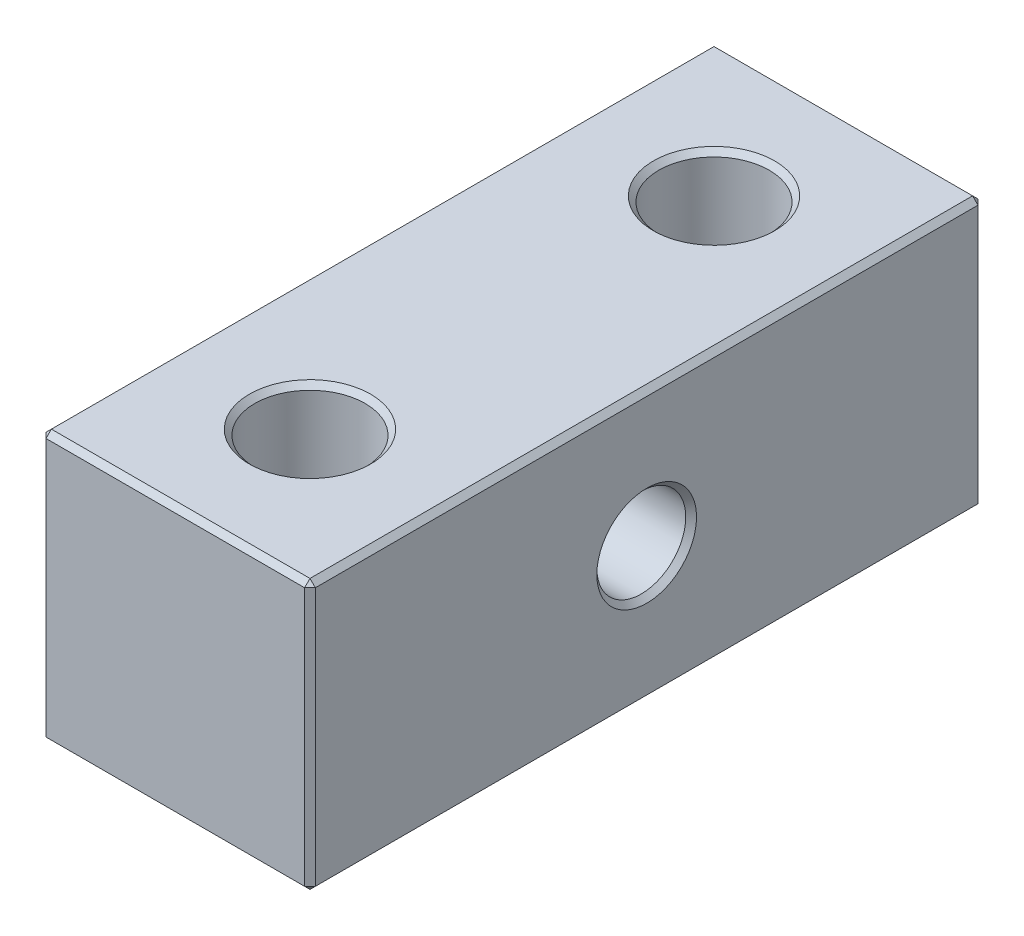
ISO-10303-21;
HEADER;
FILE_DESCRIPTION(('STEP AP214'),'2;1');
FILE_NAME('part.step','',(''),(''),'','','');
FILE_SCHEMA(('AUTOMOTIVE_DESIGN { 1 0 10303 214 1 1 1 1 }'));
ENDSEC;
DATA;
#1=APPLICATION_CONTEXT('core data for automotive mechanical design processes');
#2=APPLICATION_PROTOCOL_DEFINITION('international standard','automotive_design',2000,#1);
#3=PRODUCT_CONTEXT('',#1,'mechanical');
#4=PRODUCT('Part','Part','',(#3));
#5=PRODUCT_RELATED_PRODUCT_CATEGORY('part','',(#4));
#6=PRODUCT_DEFINITION_FORMATION('','',#4);
#7=PRODUCT_DEFINITION_CONTEXT('part definition',#1,'design');
#8=PRODUCT_DEFINITION('design','',#6,#7);
#9=PRODUCT_DEFINITION_SHAPE('','',#8);
#10=(LENGTH_UNIT() NAMED_UNIT(*) SI_UNIT(.MILLI.,.METRE.));
#11=(NAMED_UNIT(*) PLANE_ANGLE_UNIT() SI_UNIT($,.RADIAN.));
#12=(NAMED_UNIT(*) SI_UNIT($,.STERADIAN.) SOLID_ANGLE_UNIT());
#13=UNCERTAINTY_MEASURE_WITH_UNIT(LENGTH_MEASURE(1.E-05),#10,'distance_accuracy_value','');
#14=(GEOMETRIC_REPRESENTATION_CONTEXT(3) GLOBAL_UNCERTAINTY_ASSIGNED_CONTEXT((#13)) GLOBAL_UNIT_ASSIGNED_CONTEXT((#10,
#11,#12)) REPRESENTATION_CONTEXT('',''));
#15=CARTESIAN_POINT('',(0.,0.,0.));
#16=DIRECTION('',(0.,0.,1.));
#17=DIRECTION('',(1.,0.,0.));
#18=AXIS2_PLACEMENT_3D('',#15,#16,#17);
#19=CARTESIAN_POINT('',(5.,5.,12.5));
#20=DIRECTION('',(-1.,0.,0.));
#21=DIRECTION('',(0.,0.,1.));
#22=AXIS2_PLACEMENT_3D('',#19,#20,#21);
#23=PLANE('',#22);
#24=DIRECTION('',(0.,-1.,0.));
#25=VECTOR('',#24,1.);
#26=CARTESIAN_POINT('',(5.,-5.,12.3));
#27=LINE('',#26,#25);
#28=CARTESIAN_POINT('',(5.,4.8,12.3));
#29=VERTEX_POINT('',#28);
#30=CARTESIAN_POINT('',(5.,-4.8,12.3));
#31=VERTEX_POINT('',#30);
#32=EDGE_CURVE('E53',#29,#31,#27,.T.);
#33=ORIENTED_EDGE('',*,*,#32,.T.);
#34=DIRECTION('',(0.,0.,-1.));
#35=VECTOR('',#34,1.);
#36=CARTESIAN_POINT('',(5.,-4.8,12.5));
#37=LINE('',#36,#35);
#38=CARTESIAN_POINT('',(5.,-4.8,-12.3));
#39=VERTEX_POINT('',#38);
#40=EDGE_CURVE('E11',#31,#39,#37,.T.);
#41=ORIENTED_EDGE('',*,*,#40,.T.);
#42=DIRECTION('',(0.,1.,0.));
#43=VECTOR('',#42,1.);
#44=CARTESIAN_POINT('',(5.,5.,-12.3));
#45=LINE('',#44,#43);
#46=CARTESIAN_POINT('',(5.,4.8,-12.3));
#47=VERTEX_POINT('',#46);
#48=EDGE_CURVE('E246',#39,#47,#45,.T.);
#49=ORIENTED_EDGE('',*,*,#48,.T.);
#50=DIRECTION('',(0.,0.,1.));
#51=VECTOR('',#50,1.);
#52=CARTESIAN_POINT('',(5.,4.8,12.5));
#53=LINE('',#52,#51);
#54=EDGE_CURVE('E64',#47,#29,#53,.T.);
#55=ORIENTED_EDGE('',*,*,#54,.T.);
#56=EDGE_LOOP('',(#33,#41,#49,#55));
#57=FACE_BOUND('',#56,.T.);
#58=CARTESIAN_POINT('',(5.,0.,0.));
#59=DIRECTION('',(-1.,0.,0.));
#60=DIRECTION('',(0.,0.,1.));
#61=AXIS2_PLACEMENT_3D('',#58,#59,#60);
#62=CIRCLE('',#61,1.85);
#63=CARTESIAN_POINT('',(5.,0.,1.85));
#64=VERTEX_POINT('',#63);
#65=EDGE_CURVE('E243',#64,#64,#62,.T.);
#66=ORIENTED_EDGE('',*,*,#65,.T.);
#67=EDGE_LOOP('',(#66));
#68=FACE_BOUND('',#67,.T.);
#69=ADVANCED_FACE('F43',(#57,#68),#23,.F.);
#70=CARTESIAN_POINT('',(-5.,5.,12.5));
#71=DIRECTION('',(0.,-1.,0.));
#72=DIRECTION('',(0.,0.,-1.));
#73=AXIS2_PLACEMENT_3D('',#70,#71,#72);
#74=PLANE('',#73);
#75=CARTESIAN_POINT('',(0.,5.,-7.5));
#76=DIRECTION('',(0.,-1.,0.));
#77=DIRECTION('',(0.,0.,-1.));
#78=AXIS2_PLACEMENT_3D('',#75,#76,#77);
#79=CIRCLE('',#78,2.25);
#80=CARTESIAN_POINT('',(0.,5.,-9.75));
#81=VERTEX_POINT('',#80);
#82=EDGE_CURVE('E224',#81,#81,#79,.T.);
#83=ORIENTED_EDGE('',*,*,#82,.T.);
#84=EDGE_LOOP('',(#83));
#85=FACE_BOUND('',#84,.T.);
#86=CARTESIAN_POINT('',(0.,5.,7.5));
#87=DIRECTION('',(0.,-1.,0.));
#88=DIRECTION('',(0.,0.,-1.));
#89=AXIS2_PLACEMENT_3D('',#86,#87,#88);
#90=CIRCLE('',#89,2.25);
#91=CARTESIAN_POINT('',(0.,5.,5.25));
#92=VERTEX_POINT('',#91);
#93=EDGE_CURVE('E221',#92,#92,#90,.T.);
#94=ORIENTED_EDGE('',*,*,#93,.T.);
#95=EDGE_LOOP('',(#94));
#96=FACE_BOUND('',#95,.T.);
#97=DIRECTION('',(0.,0.,1.));
#98=VECTOR('',#97,1.);
#99=CARTESIAN_POINT('',(-4.8,5.,12.5));
#100=LINE('',#99,#98);
#101=CARTESIAN_POINT('',(-4.8,5.,-12.3));
#102=VERTEX_POINT('',#101);
#103=CARTESIAN_POINT('',(-4.8,5.,12.3));
#104=VERTEX_POINT('',#103);
#105=EDGE_CURVE('E216',#102,#104,#100,.T.);
#106=ORIENTED_EDGE('',*,*,#105,.T.);
#107=DIRECTION('',(1.,0.,0.));
#108=VECTOR('',#107,1.);
#109=CARTESIAN_POINT('',(5.,5.,12.3));
#110=LINE('',#109,#108);
#111=CARTESIAN_POINT('',(4.8,5.,12.3));
#112=VERTEX_POINT('',#111);
#113=EDGE_CURVE('E218',#104,#112,#110,.T.);
#114=ORIENTED_EDGE('',*,*,#113,.T.);
#115=DIRECTION('',(0.,0.,-1.));
#116=VECTOR('',#115,1.);
#117=CARTESIAN_POINT('',(4.8,5.,12.5));
#118=LINE('',#117,#116);
#119=CARTESIAN_POINT('',(4.8,5.,-12.3));
#120=VERTEX_POINT('',#119);
#121=EDGE_CURVE('E212',#112,#120,#118,.T.);
#122=ORIENTED_EDGE('',*,*,#121,.T.);
#123=DIRECTION('',(-1.,0.,0.));
#124=VECTOR('',#123,1.);
#125=CARTESIAN_POINT('',(-5.,5.,-12.3));
#126=LINE('',#125,#124);
#127=EDGE_CURVE('E214',#120,#102,#126,.T.);
#128=ORIENTED_EDGE('',*,*,#127,.T.);
#129=EDGE_LOOP('',(#106,#114,#122,#128));
#130=FACE_BOUND('',#129,.T.);
#131=ADVANCED_FACE('F346',(#85,#96,#130),#74,.F.);
#132=CARTESIAN_POINT('',(-5.,5.,12.5));
#133=DIRECTION('',(1.,0.,0.));
#134=DIRECTION('',(0.,1.,0.));
#135=AXIS2_PLACEMENT_3D('',#132,#133,#134);
#136=PLANE('',#135);
#137=CARTESIAN_POINT('',(-5.,0.,0.));
#138=DIRECTION('',(1.,0.,0.));
#139=DIRECTION('',(0.,1.,0.));
#140=AXIS2_PLACEMENT_3D('',#137,#138,#139);
#141=CIRCLE('',#140,1.84999999999999);
#142=CARTESIAN_POINT('',(-5.,1.84999999999999,0.));
#143=VERTEX_POINT('',#142);
#144=EDGE_CURVE('E203',#143,#143,#141,.T.);
#145=ORIENTED_EDGE('',*,*,#144,.T.);
#146=EDGE_LOOP('',(#145));
#147=FACE_BOUND('',#146,.T.);
#148=DIRECTION('',(0.,0.,1.));
#149=VECTOR('',#148,1.);
#150=CARTESIAN_POINT('',(-5.,-4.8,12.5));
#151=LINE('',#150,#149);
#152=CARTESIAN_POINT('',(-5.,-4.8,-12.3));
#153=VERTEX_POINT('',#152);
#154=CARTESIAN_POINT('',(-5.,-4.8,12.3));
#155=VERTEX_POINT('',#154);
#156=EDGE_CURVE('E198',#153,#155,#151,.T.);
#157=ORIENTED_EDGE('',*,*,#156,.T.);
#158=DIRECTION('',(0.,1.,0.));
#159=VECTOR('',#158,1.);
#160=CARTESIAN_POINT('',(-5.,5.,12.3));
#161=LINE('',#160,#159);
#162=CARTESIAN_POINT('',(-5.,4.8,12.3));
#163=VERTEX_POINT('',#162);
#164=EDGE_CURVE('E200',#155,#163,#161,.T.);
#165=ORIENTED_EDGE('',*,*,#164,.T.);
#166=DIRECTION('',(0.,0.,-1.));
#167=VECTOR('',#166,1.);
#168=CARTESIAN_POINT('',(-5.,4.8,12.5));
#169=LINE('',#168,#167);
#170=CARTESIAN_POINT('',(-5.,4.8,-12.3));
#171=VERTEX_POINT('',#170);
#172=EDGE_CURVE('E194',#163,#171,#169,.T.);
#173=ORIENTED_EDGE('',*,*,#172,.T.);
#174=DIRECTION('',(0.,-1.,0.));
#175=VECTOR('',#174,1.);
#176=CARTESIAN_POINT('',(-5.,5.,-12.3));
#177=LINE('',#176,#175);
#178=EDGE_CURVE('E196',#171,#153,#177,.T.);
#179=ORIENTED_EDGE('',*,*,#178,.T.);
#180=EDGE_LOOP('',(#157,#165,#173,#179));
#181=FACE_BOUND('',#180,.T.);
#182=ADVANCED_FACE('F375',(#147,#181),#136,.F.);
#183=CARTESIAN_POINT('',(-5.,-5.,12.5));
#184=DIRECTION('',(0.,1.,0.));
#185=DIRECTION('',(0.,0.,1.));
#186=AXIS2_PLACEMENT_3D('',#183,#184,#185);
#187=PLANE('',#186);
#188=CARTESIAN_POINT('',(0.,-5.,-7.5));
#189=DIRECTION('',(0.,1.,0.));
#190=DIRECTION('',(0.,0.,1.));
#191=AXIS2_PLACEMENT_3D('',#188,#189,#190);
#192=CIRCLE('',#191,2.24999999999999);
#193=CARTESIAN_POINT('',(0.,-5.,-5.25000000000001));
#194=VERTEX_POINT('',#193);
#195=EDGE_CURVE('E179',#194,#194,#192,.T.);
#196=ORIENTED_EDGE('',*,*,#195,.T.);
#197=EDGE_LOOP('',(#196));
#198=FACE_BOUND('',#197,.T.);
#199=CARTESIAN_POINT('',(0.,-5.,7.5));
#200=DIRECTION('',(0.,1.,0.));
#201=DIRECTION('',(0.,0.,1.));
#202=AXIS2_PLACEMENT_3D('',#199,#200,#201);
#203=CIRCLE('',#202,2.25);
#204=CARTESIAN_POINT('',(0.,-5.,9.74999999999999));
#205=VERTEX_POINT('',#204);
#206=EDGE_CURVE('E176',#205,#205,#203,.T.);
#207=ORIENTED_EDGE('',*,*,#206,.T.);
#208=EDGE_LOOP('',(#207));
#209=FACE_BOUND('',#208,.T.);
#210=DIRECTION('',(-1.,0.,0.));
#211=VECTOR('',#210,1.);
#212=CARTESIAN_POINT('',(-5.,-5.,12.3));
#213=LINE('',#212,#211);
#214=CARTESIAN_POINT('',(4.8,-5.,12.3));
#215=VERTEX_POINT('',#214);
#216=CARTESIAN_POINT('',(-4.8,-5.,12.3));
#217=VERTEX_POINT('',#216);
#218=EDGE_CURVE('E144',#215,#217,#213,.T.);
#219=ORIENTED_EDGE('',*,*,#218,.T.);
#220=DIRECTION('',(0.,0.,-1.));
#221=VECTOR('',#220,1.);
#222=CARTESIAN_POINT('',(-4.8,-5.,12.5));
#223=LINE('',#222,#221);
#224=CARTESIAN_POINT('',(-4.8,-5.,-12.3));
#225=VERTEX_POINT('',#224);
#226=EDGE_CURVE('E140',#217,#225,#223,.T.);
#227=ORIENTED_EDGE('',*,*,#226,.T.);
#228=DIRECTION('',(1.,0.,0.));
#229=VECTOR('',#228,1.);
#230=CARTESIAN_POINT('',(-5.,-5.,-12.3));
#231=LINE('',#230,#229);
#232=CARTESIAN_POINT('',(4.8,-5.,-12.3));
#233=VERTEX_POINT('',#232);
#234=EDGE_CURVE('E132',#225,#233,#231,.T.);
#235=ORIENTED_EDGE('',*,*,#234,.T.);
#236=DIRECTION('',(0.,0.,1.));
#237=VECTOR('',#236,1.);
#238=CARTESIAN_POINT('',(4.8,-5.,12.5));
#239=LINE('',#238,#237);
#240=EDGE_CURVE('E137',#233,#215,#239,.T.);
#241=ORIENTED_EDGE('',*,*,#240,.T.);
#242=EDGE_LOOP('',(#219,#227,#235,#241));
#243=FACE_BOUND('',#242,.T.);
#244=ADVANCED_FACE('F135',(#198,#209,#243),#187,.F.);
#245=CARTESIAN_POINT('',(0.,0.,12.5));
#246=DIRECTION('',(0.,0.,1.));
#247=DIRECTION('',(1.,0.,0.));
#248=AXIS2_PLACEMENT_3D('',#245,#246,#247);
#249=PLANE('',#248);
#250=DIRECTION('',(0.,-1.,0.));
#251=VECTOR('',#250,1.);
#252=CARTESIAN_POINT('',(-4.8,-5.,12.5));
#253=LINE('',#252,#251);
#254=CARTESIAN_POINT('',(-4.8,4.8,12.5));
#255=VERTEX_POINT('',#254);
#256=CARTESIAN_POINT('',(-4.8,-4.8,12.5));
#257=VERTEX_POINT('',#256);
#258=EDGE_CURVE('E231',#255,#257,#253,.T.);
#259=ORIENTED_EDGE('',*,*,#258,.T.);
#260=DIRECTION('',(1.,0.,0.));
#261=VECTOR('',#260,1.);
#262=CARTESIAN_POINT('',(5.,-4.8,12.5));
#263=LINE('',#262,#261);
#264=CARTESIAN_POINT('',(4.8,-4.8,12.5));
#265=VERTEX_POINT('',#264);
#266=EDGE_CURVE('E233',#257,#265,#263,.T.);
#267=ORIENTED_EDGE('',*,*,#266,.T.);
#268=DIRECTION('',(0.,1.,0.));
#269=VECTOR('',#268,1.);
#270=CARTESIAN_POINT('',(4.8,5.,12.5));
#271=LINE('',#270,#269);
#272=CARTESIAN_POINT('',(4.8,4.8,12.5));
#273=VERTEX_POINT('',#272);
#274=EDGE_CURVE('E227',#265,#273,#271,.T.);
#275=ORIENTED_EDGE('',*,*,#274,.T.);
#276=DIRECTION('',(-1.,0.,0.));
#277=VECTOR('',#276,1.);
#278=CARTESIAN_POINT('',(-5.,4.8,12.5));
#279=LINE('',#278,#277);
#280=EDGE_CURVE('E229',#273,#255,#279,.T.);
#281=ORIENTED_EDGE('',*,*,#280,.T.);
#282=EDGE_LOOP('',(#259,#267,#275,#281));
#283=FACE_BOUND('',#282,.T.);
#284=ADVANCED_FACE('F366',(#283),#249,.T.);
#285=CARTESIAN_POINT('',(0.,0.,-12.5));
#286=DIRECTION('',(0.,0.,1.));
#287=DIRECTION('',(1.,0.,0.));
#288=AXIS2_PLACEMENT_3D('',#285,#286,#287);
#289=PLANE('',#288);
#290=DIRECTION('',(0.,-1.,0.));
#291=VECTOR('',#290,1.);
#292=CARTESIAN_POINT('',(4.8,0.,-12.5));
#293=LINE('',#292,#291);
#294=CARTESIAN_POINT('',(4.8,4.8,-12.5));
#295=VERTEX_POINT('',#294);
#296=CARTESIAN_POINT('',(4.8,-4.8,-12.5));
#297=VERTEX_POINT('',#296);
#298=EDGE_CURVE('E236',#295,#297,#293,.T.);
#299=ORIENTED_EDGE('',*,*,#298,.T.);
#300=DIRECTION('',(-1.,0.,0.));
#301=VECTOR('',#300,1.);
#302=CARTESIAN_POINT('',(0.,-4.8,-12.5));
#303=LINE('',#302,#301);
#304=CARTESIAN_POINT('',(-4.8,-4.8,-12.5));
#305=VERTEX_POINT('',#304);
#306=EDGE_CURVE('E152',#297,#305,#303,.T.);
#307=ORIENTED_EDGE('',*,*,#306,.T.);
#308=DIRECTION('',(0.,1.,0.));
#309=VECTOR('',#308,1.);
#310=CARTESIAN_POINT('',(-4.8,0.,-12.5));
#311=LINE('',#310,#309);
#312=CARTESIAN_POINT('',(-4.8,4.8,-12.5));
#313=VERTEX_POINT('',#312);
#314=EDGE_CURVE('E240',#305,#313,#311,.T.);
#315=ORIENTED_EDGE('',*,*,#314,.T.);
#316=DIRECTION('',(1.,0.,0.));
#317=VECTOR('',#316,1.);
#318=CARTESIAN_POINT('',(0.,4.8,-12.5));
#319=LINE('',#318,#317);
#320=EDGE_CURVE('E238',#313,#295,#319,.T.);
#321=ORIENTED_EDGE('',*,*,#320,.T.);
#322=EDGE_LOOP('',(#299,#307,#315,#321));
#323=FACE_BOUND('',#322,.T.);
#324=ADVANCED_FACE('F341',(#323),#289,.F.);
#325=CARTESIAN_POINT('',(5.,0.,0.));
#326=DIRECTION('',(1.,0.,0.));
#327=DIRECTION('',(0.,0.,-1.));
#328=AXIS2_PLACEMENT_3D('',#325,#326,#327);
#329=CYLINDRICAL_SURFACE('',#328,1.65);
#330=CARTESIAN_POINT('',(-4.8,0.,0.));
#331=DIRECTION('',(1.,0.,0.));
#332=DIRECTION('',(0.,0.,-1.));
#333=AXIS2_PLACEMENT_3D('',#330,#331,#332);
#334=CIRCLE('',#333,1.65);
#335=CARTESIAN_POINT('',(-4.8,0.,-1.65));
#336=VERTEX_POINT('',#335);
#337=EDGE_CURVE('E209',#336,#336,#334,.F.);
#338=ORIENTED_EDGE('',*,*,#337,.T.);
#339=EDGE_LOOP('',(#338));
#340=FACE_BOUND('',#339,.T.);
#341=CARTESIAN_POINT('',(4.8,0.,0.));
#342=DIRECTION('',(-1.,0.,0.));
#343=DIRECTION('',(0.,0.,1.));
#344=AXIS2_PLACEMENT_3D('',#341,#342,#343);
#345=CIRCLE('',#344,1.65);
#346=CARTESIAN_POINT('',(4.8,0.,1.65));
#347=VERTEX_POINT('',#346);
#348=EDGE_CURVE('E206',#347,#347,#345,.F.);
#349=ORIENTED_EDGE('',*,*,#348,.T.);
#350=EDGE_LOOP('',(#349));
#351=FACE_BOUND('',#350,.T.);
#352=ADVANCED_FACE('F354',(#340,#351),#329,.F.);
#353=CARTESIAN_POINT('',(0.,5.,-7.5));
#354=DIRECTION('',(0.,1.,0.));
#355=DIRECTION('',(0.,0.,1.));
#356=AXIS2_PLACEMENT_3D('',#353,#354,#355);
#357=CYLINDRICAL_SURFACE('',#356,2.05);
#358=CARTESIAN_POINT('',(0.,-4.8,-7.5));
#359=DIRECTION('',(0.,1.,0.));
#360=DIRECTION('',(0.,0.,1.));
#361=AXIS2_PLACEMENT_3D('',#358,#359,#360);
#362=CIRCLE('',#361,2.05);
#363=CARTESIAN_POINT('',(0.,-4.8,-5.45));
#364=VERTEX_POINT('',#363);
#365=EDGE_CURVE('E185',#364,#364,#362,.F.);
#366=ORIENTED_EDGE('',*,*,#365,.T.);
#367=EDGE_LOOP('',(#366));
#368=FACE_BOUND('',#367,.T.);
#369=CARTESIAN_POINT('',(0.,4.8,-7.5));
#370=DIRECTION('',(0.,-1.,0.));
#371=DIRECTION('',(0.,0.,-1.));
#372=AXIS2_PLACEMENT_3D('',#369,#370,#371);
#373=CIRCLE('',#372,2.05);
#374=CARTESIAN_POINT('',(0.,4.8,-9.55));
#375=VERTEX_POINT('',#374);
#376=EDGE_CURVE('E182',#375,#375,#373,.F.);
#377=ORIENTED_EDGE('',*,*,#376,.T.);
#378=EDGE_LOOP('',(#377));
#379=FACE_BOUND('',#378,.T.);
#380=ADVANCED_FACE('F356',(#368,#379),#357,.F.);
#381=CARTESIAN_POINT('',(0.,5.,7.5));
#382=DIRECTION('',(0.,1.,0.));
#383=DIRECTION('',(0.,0.,1.));
#384=AXIS2_PLACEMENT_3D('',#381,#382,#383);
#385=CYLINDRICAL_SURFACE('',#384,2.05);
#386=CARTESIAN_POINT('',(0.,-4.8,7.5));
#387=DIRECTION('',(0.,1.,0.));
#388=DIRECTION('',(0.,0.,1.));
#389=AXIS2_PLACEMENT_3D('',#386,#387,#388);
#390=CIRCLE('',#389,2.05);
#391=CARTESIAN_POINT('',(0.,-4.8,9.55));
#392=VERTEX_POINT('',#391);
#393=EDGE_CURVE('E191',#392,#392,#390,.F.);
#394=ORIENTED_EDGE('',*,*,#393,.T.);
#395=EDGE_LOOP('',(#394));
#396=FACE_BOUND('',#395,.T.);
#397=CARTESIAN_POINT('',(0.,4.8,7.5));
#398=DIRECTION('',(0.,-1.,0.));
#399=DIRECTION('',(0.,0.,-1.));
#400=AXIS2_PLACEMENT_3D('',#397,#398,#399);
#401=CIRCLE('',#400,2.05);
#402=CARTESIAN_POINT('',(0.,4.8,5.45));
#403=VERTEX_POINT('',#402);
#404=EDGE_CURVE('E188',#403,#403,#401,.F.);
#405=ORIENTED_EDGE('',*,*,#404,.T.);
#406=EDGE_LOOP('',(#405));
#407=FACE_BOUND('',#406,.T.);
#408=ADVANCED_FACE('F363',(#396,#407),#385,.F.);
#409=CARTESIAN_POINT('',(0.,-5.,-7.5));
#410=DIRECTION('',(0.,-1.,0.));
#411=DIRECTION('',(0.,0.,-1.));
#412=AXIS2_PLACEMENT_3D('',#409,#410,#411);
#413=CONICAL_SURFACE('',#412,2.24999999999999,0.78539816339744);
#414=ORIENTED_EDGE('',*,*,#365,.F.);
#415=EDGE_LOOP('',(#414));
#416=FACE_BOUND('',#415,.T.);
#417=ORIENTED_EDGE('',*,*,#195,.F.);
#418=EDGE_LOOP('',(#417));
#419=FACE_BOUND('',#418,.T.);
#420=ADVANCED_FACE('F384',(#416,#419),#413,.F.);
#421=CARTESIAN_POINT('',(0.,-5.,7.5));
#422=DIRECTION('',(0.,-1.,0.));
#423=DIRECTION('',(0.,0.,-1.));
#424=AXIS2_PLACEMENT_3D('',#421,#422,#423);
#425=CONICAL_SURFACE('',#424,2.25,0.78539816339744);
#426=ORIENTED_EDGE('',*,*,#393,.F.);
#427=EDGE_LOOP('',(#426));
#428=FACE_BOUND('',#427,.T.);
#429=ORIENTED_EDGE('',*,*,#206,.F.);
#430=EDGE_LOOP('',(#429));
#431=FACE_BOUND('',#430,.T.);
#432=ADVANCED_FACE('F390',(#428,#431),#425,.F.);
#433=CARTESIAN_POINT('',(-5.,0.,0.));
#434=DIRECTION('',(-1.,0.,0.));
#435=DIRECTION('',(0.,0.,1.));
#436=AXIS2_PLACEMENT_3D('',#433,#434,#435);
#437=CONICAL_SURFACE('',#436,1.84999999999999,0.785398163397446);
#438=ORIENTED_EDGE('',*,*,#337,.F.);
#439=EDGE_LOOP('',(#438));
#440=FACE_BOUND('',#439,.T.);
#441=ORIENTED_EDGE('',*,*,#144,.F.);
#442=EDGE_LOOP('',(#441));
#443=FACE_BOUND('',#442,.T.);
#444=ADVANCED_FACE('F397',(#440,#443),#437,.F.);
#445=CARTESIAN_POINT('',(0.,4.8,-7.5));
#446=DIRECTION('',(0.,1.,0.));
#447=DIRECTION('',(0.,0.,1.));
#448=AXIS2_PLACEMENT_3D('',#445,#446,#447);
#449=CONICAL_SURFACE('',#448,2.05,0.785398163397457);
#450=ORIENTED_EDGE('',*,*,#82,.F.);
#451=EDGE_LOOP('',(#450));
#452=FACE_BOUND('',#451,.T.);
#453=ORIENTED_EDGE('',*,*,#376,.F.);
#454=EDGE_LOOP('',(#453));
#455=FACE_BOUND('',#454,.T.);
#456=ADVANCED_FACE('F404',(#452,#455),#449,.F.);
#457=CARTESIAN_POINT('',(0.,4.8,7.5));
#458=DIRECTION('',(0.,1.,0.));
#459=DIRECTION('',(0.,0.,1.));
#460=AXIS2_PLACEMENT_3D('',#457,#458,#459);
#461=CONICAL_SURFACE('',#460,2.05,0.785398163397457);
#462=ORIENTED_EDGE('',*,*,#93,.F.);
#463=EDGE_LOOP('',(#462));
#464=FACE_BOUND('',#463,.T.);
#465=ORIENTED_EDGE('',*,*,#404,.F.);
#466=EDGE_LOOP('',(#465));
#467=FACE_BOUND('',#466,.T.);
#468=ADVANCED_FACE('F411',(#464,#467),#461,.F.);
#469=CARTESIAN_POINT('',(-5.,5.,-12.3));
#470=DIRECTION('',(0.,-0.707106781186547,0.707106781186547));
#471=DIRECTION('',(-1.,0.,0.));
#472=AXIS2_PLACEMENT_3D('',#469,#470,#471);
#473=PLANE('',#472);
#474=DIRECTION('',(0.,0.707106781186547,0.707106781186547));
#475=VECTOR('',#474,1.);
#476=CARTESIAN_POINT('',(-4.8,4.8,-12.5));
#477=LINE('',#476,#475);
#478=EDGE_CURVE('E48',#102,#313,#477,.F.);
#479=ORIENTED_EDGE('',*,*,#478,.F.);
#480=ORIENTED_EDGE('',*,*,#127,.F.);
#481=DIRECTION('',(0.,-0.707106781186547,-0.707106781186547));
#482=VECTOR('',#481,1.);
#483=CARTESIAN_POINT('',(4.8,4.8,-12.5));
#484=LINE('',#483,#482);
#485=EDGE_CURVE('E172',#295,#120,#484,.F.);
#486=ORIENTED_EDGE('',*,*,#485,.F.);
#487=ORIENTED_EDGE('',*,*,#320,.F.);
#488=EDGE_LOOP('',(#479,#480,#486,#487));
#489=FACE_BOUND('',#488,.T.);
#490=ADVANCED_FACE('F418',(#489),#473,.F.);
#491=CARTESIAN_POINT('',(-4.8,4.8,-12.5));
#492=DIRECTION('',(-0.577350269189626,0.577350269189626,-0.577350269189626));
#493=DIRECTION('',(-0.707106781186547,0.,0.707106781186547));
#494=AXIS2_PLACEMENT_3D('',#491,#492,#493);
#495=PLANE('',#494);
#496=DIRECTION('',(-0.707106781186547,-0.707106781186547,0.));
#497=VECTOR('',#496,1.);
#498=CARTESIAN_POINT('',(-4.9,4.9,-12.3));
#499=LINE('',#498,#497);
#500=EDGE_CURVE('E291',#102,#171,#499,.T.);
#501=ORIENTED_EDGE('',*,*,#500,.F.);
#502=ORIENTED_EDGE('',*,*,#478,.T.);
#503=DIRECTION('',(0.707106781186548,0.,-0.707106781186548));
#504=VECTOR('',#503,1.);
#505=CARTESIAN_POINT('',(-4.8,4.8,-12.5));
#506=LINE('',#505,#504);
#507=EDGE_CURVE('E294',#171,#313,#506,.T.);
#508=ORIENTED_EDGE('',*,*,#507,.F.);
#509=EDGE_LOOP('',(#501,#502,#508));
#510=FACE_BOUND('',#509,.T.);
#511=ADVANCED_FACE('F519',(#510),#495,.T.);
#512=CARTESIAN_POINT('',(4.8,4.8,-12.5));
#513=DIRECTION('',(0.577350269189626,0.577350269189626,-0.577350269189626));
#514=DIRECTION('',(-0.707106781186547,0.,-0.707106781186547));
#515=AXIS2_PLACEMENT_3D('',#512,#513,#514);
#516=PLANE('',#515);
#517=DIRECTION('',(0.707106781186547,0.,0.707106781186547));
#518=VECTOR('',#517,1.);
#519=CARTESIAN_POINT('',(4.8,4.8,-12.5));
#520=LINE('',#519,#518);
#521=EDGE_CURVE('E285',#295,#47,#520,.T.);
#522=ORIENTED_EDGE('',*,*,#521,.F.);
#523=ORIENTED_EDGE('',*,*,#485,.T.);
#524=DIRECTION('',(-0.707106781186547,0.707106781186547,0.));
#525=VECTOR('',#524,1.);
#526=CARTESIAN_POINT('',(4.9,4.9,-12.3));
#527=LINE('',#526,#525);
#528=EDGE_CURVE('E288',#47,#120,#527,.T.);
#529=ORIENTED_EDGE('',*,*,#528,.F.);
#530=EDGE_LOOP('',(#522,#523,#529));
#531=FACE_BOUND('',#530,.T.);
#532=ADVANCED_FACE('F301',(#531),#516,.T.);
#533=CARTESIAN_POINT('',(-5.,5.,-12.3));
#534=DIRECTION('',(0.707106781186547,0.,0.707106781186547));
#535=DIRECTION('',(0.,-1.,0.));
#536=AXIS2_PLACEMENT_3D('',#533,#534,#535);
#537=PLANE('',#536);
#538=ORIENTED_EDGE('',*,*,#507,.T.);
#539=ORIENTED_EDGE('',*,*,#314,.F.);
#540=DIRECTION('',(-0.707106781186547,0.,0.707106781186547));
#541=VECTOR('',#540,1.);
#542=CARTESIAN_POINT('',(-4.8,-4.8,-12.5));
#543=LINE('',#542,#541);
#544=EDGE_CURVE('E281',#153,#305,#543,.F.);
#545=ORIENTED_EDGE('',*,*,#544,.F.);
#546=ORIENTED_EDGE('',*,*,#178,.F.);
#547=EDGE_LOOP('',(#538,#539,#545,#546));
#548=FACE_BOUND('',#547,.T.);
#549=ADVANCED_FACE('F337',(#548),#537,.F.);
#550=CARTESIAN_POINT('',(-5.,4.8,12.5));
#551=DIRECTION('',(0.707106781186547,-0.707106781186547,0.));
#552=DIRECTION('',(0.,0.,-1.));
#553=AXIS2_PLACEMENT_3D('',#550,#551,#552);
#554=PLANE('',#553);
#555=ORIENTED_EDGE('',*,*,#500,.T.);
#556=ORIENTED_EDGE('',*,*,#172,.F.);
#557=DIRECTION('',(0.707106781186547,0.707106781186547,0.));
#558=VECTOR('',#557,1.);
#559=CARTESIAN_POINT('',(-5.,4.8,12.3));
#560=LINE('',#559,#558);
#561=EDGE_CURVE('E278',#104,#163,#560,.F.);
#562=ORIENTED_EDGE('',*,*,#561,.F.);
#563=ORIENTED_EDGE('',*,*,#105,.F.);
#564=EDGE_LOOP('',(#555,#556,#562,#563));
#565=FACE_BOUND('',#564,.T.);
#566=ADVANCED_FACE('F501',(#565),#554,.F.);
#567=CARTESIAN_POINT('',(0.,4.8,12.5));
#568=DIRECTION('',(0.,0.707106781186547,0.707106781186547));
#569=DIRECTION('',(1.,0.,0.));
#570=AXIS2_PLACEMENT_3D('',#567,#568,#569);
#571=PLANE('',#570);
#572=DIRECTION('',(0.,-0.707106781186547,0.707106781186547));
#573=VECTOR('',#572,1.);
#574=CARTESIAN_POINT('',(4.8,5.,12.3));
#575=LINE('',#574,#573);
#576=EDGE_CURVE('E272',#112,#273,#575,.T.);
#577=ORIENTED_EDGE('',*,*,#576,.F.);
#578=ORIENTED_EDGE('',*,*,#113,.F.);
#579=DIRECTION('',(0.,0.707106781186547,-0.707106781186547));
#580=VECTOR('',#579,1.);
#581=CARTESIAN_POINT('',(-4.8,4.9,12.4));
#582=LINE('',#581,#580);
#583=EDGE_CURVE('E275',#255,#104,#582,.T.);
#584=ORIENTED_EDGE('',*,*,#583,.F.);
#585=ORIENTED_EDGE('',*,*,#280,.F.);
#586=EDGE_LOOP('',(#577,#578,#584,#585));
#587=FACE_BOUND('',#586,.T.);
#588=ADVANCED_FACE('F495',(#587),#571,.T.);
#589=CARTESIAN_POINT('',(4.8,5.,12.5));
#590=DIRECTION('',(-0.707106781186547,-0.707106781186547,0.));
#591=DIRECTION('',(0.,0.,-1.));
#592=AXIS2_PLACEMENT_3D('',#589,#590,#591);
#593=PLANE('',#592);
#594=ORIENTED_EDGE('',*,*,#528,.T.);
#595=ORIENTED_EDGE('',*,*,#121,.F.);
#596=DIRECTION('',(0.707106781186547,-0.707106781186547,0.));
#597=VECTOR('',#596,1.);
#598=CARTESIAN_POINT('',(4.8,5.,12.3));
#599=LINE('',#598,#597);
#600=EDGE_CURVE('E270',#29,#112,#599,.F.);
#601=ORIENTED_EDGE('',*,*,#600,.F.);
#602=ORIENTED_EDGE('',*,*,#54,.F.);
#603=EDGE_LOOP('',(#594,#595,#601,#602));
#604=FACE_BOUND('',#603,.T.);
#605=ADVANCED_FACE('F308',(#604),#593,.F.);
#606=CARTESIAN_POINT('',(5.,5.,-12.3));
#607=DIRECTION('',(-0.707106781186547,0.,0.707106781186547));
#608=DIRECTION('',(0.,1.,0.));
#609=AXIS2_PLACEMENT_3D('',#606,#607,#608);
#610=PLANE('',#609);
#611=ORIENTED_EDGE('',*,*,#521,.T.);
#612=ORIENTED_EDGE('',*,*,#48,.F.);
#613=DIRECTION('',(-0.707106781186547,0.,-0.707106781186547));
#614=VECTOR('',#613,1.);
#615=CARTESIAN_POINT('',(4.9,-4.8,-12.4));
#616=LINE('',#615,#614);
#617=EDGE_CURVE('E156',#297,#39,#616,.F.);
#618=ORIENTED_EDGE('',*,*,#617,.F.);
#619=ORIENTED_EDGE('',*,*,#298,.F.);
#620=EDGE_LOOP('',(#611,#612,#618,#619));
#621=FACE_BOUND('',#620,.T.);
#622=ADVANCED_FACE('F343',(#621),#610,.F.);
#623=CARTESIAN_POINT('',(-5.,-5.,-12.3));
#624=DIRECTION('',(0.,0.707106781186547,0.707106781186547));
#625=DIRECTION('',(1.,0.,0.));
#626=AXIS2_PLACEMENT_3D('',#623,#624,#625);
#627=PLANE('',#626);
#628=DIRECTION('',(0.,0.707106781186547,-0.707106781186547));
#629=VECTOR('',#628,1.);
#630=CARTESIAN_POINT('',(-4.8,-4.8,-12.5));
#631=LINE('',#630,#629);
#632=EDGE_CURVE('E283',#305,#225,#631,.F.);
#633=ORIENTED_EDGE('',*,*,#632,.F.);
#634=ORIENTED_EDGE('',*,*,#306,.F.);
#635=DIRECTION('',(0.,-0.707106781186547,0.707106781186547));
#636=VECTOR('',#635,1.);
#637=CARTESIAN_POINT('',(4.8,-5.,-12.3));
#638=LINE('',#637,#636);
#639=EDGE_CURVE('E148',#233,#297,#638,.F.);
#640=ORIENTED_EDGE('',*,*,#639,.F.);
#641=ORIENTED_EDGE('',*,*,#234,.F.);
#642=EDGE_LOOP('',(#633,#634,#640,#641));
#643=FACE_BOUND('',#642,.T.);
#644=ADVANCED_FACE('F150',(#643),#627,.F.);
#645=CARTESIAN_POINT('',(-4.8,-4.8,-12.5));
#646=DIRECTION('',(-0.577350269189626,-0.577350269189626,-0.577350269189626));
#647=DIRECTION('',(-0.707106781186547,0.,0.707106781186547));
#648=AXIS2_PLACEMENT_3D('',#645,#646,#647);
#649=PLANE('',#648);
#650=ORIENTED_EDGE('',*,*,#544,.T.);
#651=ORIENTED_EDGE('',*,*,#632,.T.);
#652=DIRECTION('',(0.707106781186547,-0.707106781186547,0.));
#653=VECTOR('',#652,1.);
#654=CARTESIAN_POINT('',(-4.9,-4.9,-12.3));
#655=LINE('',#654,#653);
#656=EDGE_CURVE('E157',#153,#225,#655,.T.);
#657=ORIENTED_EDGE('',*,*,#656,.F.);
#658=EDGE_LOOP('',(#650,#651,#657));
#659=FACE_BOUND('',#658,.T.);
#660=ADVANCED_FACE('F333',(#659),#649,.T.);
#661=CARTESIAN_POINT('',(-5.,4.8,12.3));
#662=DIRECTION('',(-0.577350269189626,0.577350269189626,0.577350269189626));
#663=DIRECTION('',(0.707106781186547,0.,0.707106781186547));
#664=AXIS2_PLACEMENT_3D('',#661,#662,#663);
#665=PLANE('',#664);
#666=ORIENTED_EDGE('',*,*,#583,.T.);
#667=ORIENTED_EDGE('',*,*,#561,.T.);
#668=DIRECTION('',(0.707106781186548,0.,0.707106781186548));
#669=VECTOR('',#668,1.);
#670=CARTESIAN_POINT('',(-5.,4.8,12.3));
#671=LINE('',#670,#669);
#672=EDGE_CURVE('E265',#255,#163,#671,.F.);
#673=ORIENTED_EDGE('',*,*,#672,.F.);
#674=EDGE_LOOP('',(#666,#667,#673));
#675=FACE_BOUND('',#674,.T.);
#676=ADVANCED_FACE('F468',(#675),#665,.T.);
#677=CARTESIAN_POINT('',(4.8,5.,12.3));
#678=DIRECTION('',(0.577350269189626,0.577350269189626,0.577350269189626));
#679=DIRECTION('',(0.707106781186547,0.,-0.707106781186547));
#680=AXIS2_PLACEMENT_3D('',#677,#678,#679);
#681=PLANE('',#680);
#682=ORIENTED_EDGE('',*,*,#600,.T.);
#683=ORIENTED_EDGE('',*,*,#576,.T.);
#684=DIRECTION('',(0.707106781186547,0.,-0.707106781186547));
#685=VECTOR('',#684,1.);
#686=CARTESIAN_POINT('',(4.9,4.8,12.4));
#687=LINE('',#686,#685);
#688=EDGE_CURVE('E163',#29,#273,#687,.F.);
#689=ORIENTED_EDGE('',*,*,#688,.F.);
#690=EDGE_LOOP('',(#682,#683,#689));
#691=FACE_BOUND('',#690,.T.);
#692=ADVANCED_FACE('F312',(#691),#681,.T.);
#693=CARTESIAN_POINT('',(4.8,-5.,-12.3));
#694=DIRECTION('',(0.577350269189626,-0.577350269189626,-0.577350269189626));
#695=DIRECTION('',(-0.707106781186547,0.,-0.707106781186547));
#696=AXIS2_PLACEMENT_3D('',#693,#694,#695);
#697=PLANE('',#696);
#698=ORIENTED_EDGE('',*,*,#639,.T.);
#699=ORIENTED_EDGE('',*,*,#617,.T.);
#700=DIRECTION('',(0.707106781186547,0.707106781186547,0.));
#701=VECTOR('',#700,1.);
#702=CARTESIAN_POINT('',(4.8,-5.,-12.3));
#703=LINE('',#702,#701);
#704=EDGE_CURVE('E159',#233,#39,#703,.T.);
#705=ORIENTED_EDGE('',*,*,#704,.F.);
#706=EDGE_LOOP('',(#698,#699,#705));
#707=FACE_BOUND('',#706,.T.);
#708=ADVANCED_FACE('F160',(#707),#697,.T.);
#709=CARTESIAN_POINT('',(-4.8,-5.,12.5));
#710=DIRECTION('',(0.707106781186547,0.707106781186547,0.));
#711=DIRECTION('',(0.,0.,-1.));
#712=AXIS2_PLACEMENT_3D('',#709,#710,#711);
#713=PLANE('',#712);
#714=ORIENTED_EDGE('',*,*,#656,.T.);
#715=ORIENTED_EDGE('',*,*,#226,.F.);
#716=DIRECTION('',(-0.707106781186547,0.707106781186547,0.));
#717=VECTOR('',#716,1.);
#718=CARTESIAN_POINT('',(-4.8,-5.,12.3));
#719=LINE('',#718,#717);
#720=EDGE_CURVE('E164',#155,#217,#719,.F.);
#721=ORIENTED_EDGE('',*,*,#720,.F.);
#722=ORIENTED_EDGE('',*,*,#156,.F.);
#723=EDGE_LOOP('',(#714,#715,#721,#722));
#724=FACE_BOUND('',#723,.T.);
#725=ADVANCED_FACE('F330',(#724),#713,.F.);
#726=CARTESIAN_POINT('',(-4.8,0.,12.5));
#727=DIRECTION('',(-0.707106781186547,0.,0.707106781186547));
#728=DIRECTION('',(0.,1.,0.));
#729=AXIS2_PLACEMENT_3D('',#726,#727,#728);
#730=PLANE('',#729);
#731=ORIENTED_EDGE('',*,*,#672,.T.);
#732=ORIENTED_EDGE('',*,*,#164,.F.);
#733=DIRECTION('',(-0.707106781186547,0.,-0.707106781186547));
#734=VECTOR('',#733,1.);
#735=CARTESIAN_POINT('',(-4.9,-4.8,12.4));
#736=LINE('',#735,#734);
#737=EDGE_CURVE('E258',#257,#155,#736,.T.);
#738=ORIENTED_EDGE('',*,*,#737,.F.);
#739=ORIENTED_EDGE('',*,*,#258,.F.);
#740=EDGE_LOOP('',(#731,#732,#738,#739));
#741=FACE_BOUND('',#740,.T.);
#742=ADVANCED_FACE('F446',(#741),#730,.T.);
#743=CARTESIAN_POINT('',(4.8,0.,12.5));
#744=DIRECTION('',(0.707106781186547,0.,0.707106781186547));
#745=DIRECTION('',(0.,-1.,0.));
#746=AXIS2_PLACEMENT_3D('',#743,#744,#745);
#747=PLANE('',#746);
#748=ORIENTED_EDGE('',*,*,#688,.T.);
#749=ORIENTED_EDGE('',*,*,#274,.F.);
#750=DIRECTION('',(-0.707106781186547,0.,0.707106781186547));
#751=VECTOR('',#750,1.);
#752=CARTESIAN_POINT('',(4.8,-4.8,12.5));
#753=LINE('',#752,#751);
#754=EDGE_CURVE('E255',#31,#265,#753,.T.);
#755=ORIENTED_EDGE('',*,*,#754,.F.);
#756=ORIENTED_EDGE('',*,*,#32,.F.);
#757=EDGE_LOOP('',(#748,#749,#755,#756));
#758=FACE_BOUND('',#757,.T.);
#759=ADVANCED_FACE('F316',(#758),#747,.T.);
#760=CARTESIAN_POINT('',(5.,-4.8,12.5));
#761=DIRECTION('',(-0.707106781186547,0.707106781186547,0.));
#762=DIRECTION('',(0.,0.,-1.));
#763=AXIS2_PLACEMENT_3D('',#760,#761,#762);
#764=PLANE('',#763);
#765=ORIENTED_EDGE('',*,*,#704,.T.);
#766=ORIENTED_EDGE('',*,*,#40,.F.);
#767=DIRECTION('',(-0.707106781186547,-0.707106781186547,0.));
#768=VECTOR('',#767,1.);
#769=CARTESIAN_POINT('',(4.9,-4.9,12.3));
#770=LINE('',#769,#768);
#771=EDGE_CURVE('E168',#215,#31,#770,.F.);
#772=ORIENTED_EDGE('',*,*,#771,.F.);
#773=ORIENTED_EDGE('',*,*,#240,.F.);
#774=EDGE_LOOP('',(#765,#766,#772,#773));
#775=FACE_BOUND('',#774,.T.);
#776=ADVANCED_FACE('F166',(#775),#764,.F.);
#777=CARTESIAN_POINT('',(-4.8,-5.,12.3));
#778=DIRECTION('',(-0.577350269189626,-0.577350269189626,0.577350269189626));
#779=DIRECTION('',(0.707106781186547,0.,0.707106781186547));
#780=AXIS2_PLACEMENT_3D('',#777,#778,#779);
#781=PLANE('',#780);
#782=ORIENTED_EDGE('',*,*,#737,.T.);
#783=ORIENTED_EDGE('',*,*,#720,.T.);
#784=DIRECTION('',(0.,0.707106781186547,0.707106781186547));
#785=VECTOR('',#784,1.);
#786=CARTESIAN_POINT('',(-4.8,-5.,12.3));
#787=LINE('',#786,#785);
#788=EDGE_CURVE('E252',#257,#217,#787,.F.);
#789=ORIENTED_EDGE('',*,*,#788,.F.);
#790=EDGE_LOOP('',(#782,#783,#789));
#791=FACE_BOUND('',#790,.T.);
#792=ADVANCED_FACE('F326',(#791),#781,.T.);
#793=CARTESIAN_POINT('',(4.8,-4.8,12.5));
#794=DIRECTION('',(0.577350269189626,-0.577350269189626,0.577350269189626));
#795=DIRECTION('',(0.707106781186547,0.,-0.707106781186547));
#796=AXIS2_PLACEMENT_3D('',#793,#794,#795);
#797=PLANE('',#796);
#798=ORIENTED_EDGE('',*,*,#771,.T.);
#799=ORIENTED_EDGE('',*,*,#754,.T.);
#800=DIRECTION('',(0.,-0.707106781186547,-0.707106781186547));
#801=VECTOR('',#800,1.);
#802=CARTESIAN_POINT('',(4.8,-4.8,12.5));
#803=LINE('',#802,#801);
#804=EDGE_CURVE('E250',#215,#265,#803,.F.);
#805=ORIENTED_EDGE('',*,*,#804,.F.);
#806=EDGE_LOOP('',(#798,#799,#805));
#807=FACE_BOUND('',#806,.T.);
#808=ADVANCED_FACE('F319',(#807),#797,.T.);
#809=CARTESIAN_POINT('',(0.,-4.8,12.5));
#810=DIRECTION('',(0.,-0.707106781186547,0.707106781186547));
#811=DIRECTION('',(-1.,0.,0.));
#812=AXIS2_PLACEMENT_3D('',#809,#810,#811);
#813=PLANE('',#812);
#814=ORIENTED_EDGE('',*,*,#788,.T.);
#815=ORIENTED_EDGE('',*,*,#218,.F.);
#816=ORIENTED_EDGE('',*,*,#804,.T.);
#817=ORIENTED_EDGE('',*,*,#266,.F.);
#818=EDGE_LOOP('',(#814,#815,#816,#817));
#819=FACE_BOUND('',#818,.T.);
#820=ADVANCED_FACE('F322',(#819),#813,.T.);
#821=CARTESIAN_POINT('',(4.8,0.,0.));
#822=DIRECTION('',(1.,0.,0.));
#823=DIRECTION('',(0.,0.,-1.));
#824=AXIS2_PLACEMENT_3D('',#821,#822,#823);
#825=CONICAL_SURFACE('',#824,1.65,0.785398163397451);
#826=ORIENTED_EDGE('',*,*,#65,.F.);
#827=EDGE_LOOP('',(#826));
#828=FACE_BOUND('',#827,.T.);
#829=ORIENTED_EDGE('',*,*,#348,.F.);
#830=EDGE_LOOP('',(#829));
#831=FACE_BOUND('',#830,.T.);
#832=ADVANCED_FACE('F46',(#828,#831),#825,.F.);
#833=CLOSED_SHELL('',(#69,#131,#182,#244,#284,#324,#352,#380,#408,#420,#432,#444,#456,#468,#490,
#511,#532,#549,#566,#588,#605,#622,#644,#660,#676,#692,#708,#725,#742,#759,#776,#792,#808,#820,#832));
#834=MANIFOLD_SOLID_BREP('B2',#833);
#835=ADVANCED_BREP_SHAPE_REPRESENTATION('',(#18,#834),#14);
#836=SHAPE_DEFINITION_REPRESENTATION(#9,#835);
ENDSEC;
END-ISO-10303-21;
